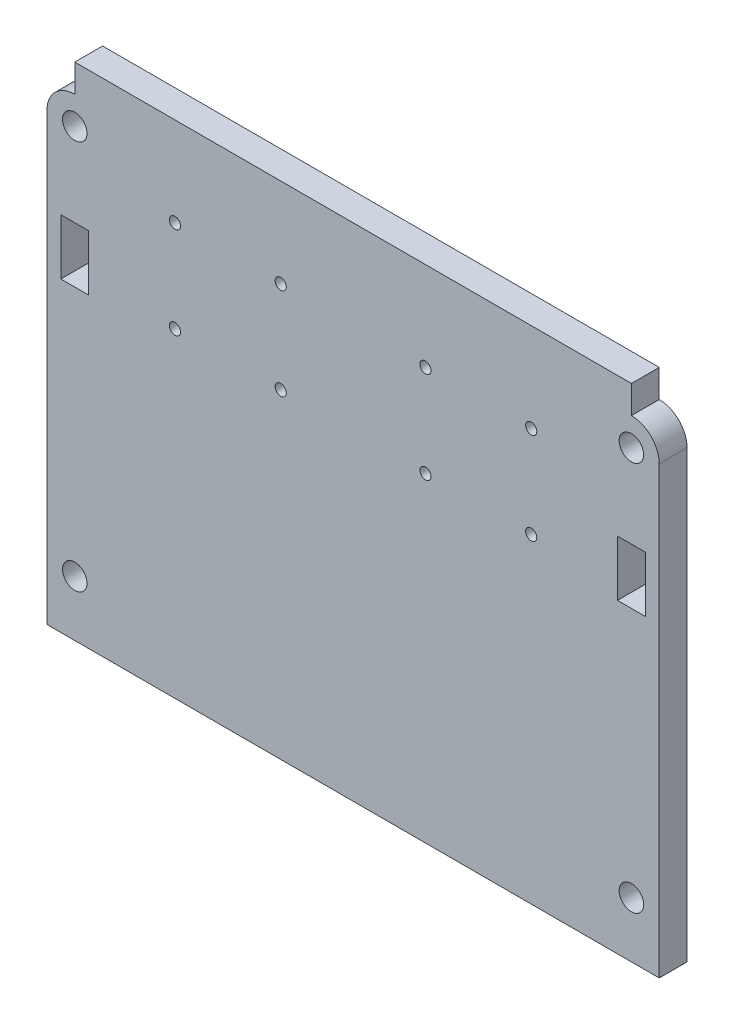
ISO-10303-21;
HEADER;
FILE_DESCRIPTION(('STEP AP214'),'2;1');
FILE_NAME('part.step','',(''),(''),'','','');
FILE_SCHEMA(('AUTOMOTIVE_DESIGN { 1 0 10303 214 1 1 1 1 }'));
ENDSEC;
DATA;
#1=APPLICATION_CONTEXT('core data for automotive mechanical design processes');
#2=APPLICATION_PROTOCOL_DEFINITION('international standard','automotive_design',2000,#1);
#3=PRODUCT_CONTEXT('',#1,'mechanical');
#4=PRODUCT('Part','Part','',(#3));
#5=PRODUCT_RELATED_PRODUCT_CATEGORY('part','',(#4));
#6=PRODUCT_DEFINITION_FORMATION('','',#4);
#7=PRODUCT_DEFINITION_CONTEXT('part definition',#1,'design');
#8=PRODUCT_DEFINITION('design','',#6,#7);
#9=PRODUCT_DEFINITION_SHAPE('','',#8);
#10=(LENGTH_UNIT() NAMED_UNIT(*) SI_UNIT(.MILLI.,.METRE.));
#11=(NAMED_UNIT(*) PLANE_ANGLE_UNIT() SI_UNIT($,.RADIAN.));
#12=(NAMED_UNIT(*) SI_UNIT($,.STERADIAN.) SOLID_ANGLE_UNIT());
#13=UNCERTAINTY_MEASURE_WITH_UNIT(LENGTH_MEASURE(1.E-05),#10,'distance_accuracy_value','');
#14=(GEOMETRIC_REPRESENTATION_CONTEXT(3) GLOBAL_UNCERTAINTY_ASSIGNED_CONTEXT((#13)) GLOBAL_UNIT_ASSIGNED_CONTEXT((#10,
#11,#12)) REPRESENTATION_CONTEXT('',''));
#15=CARTESIAN_POINT('',(0.,0.,0.));
#16=DIRECTION('',(0.,0.,1.));
#17=DIRECTION('',(1.,0.,0.));
#18=AXIS2_PLACEMENT_3D('',#15,#16,#17);
#19=CARTESIAN_POINT('',(100.,100.,5.));
#20=DIRECTION('',(0.,0.,-1.));
#21=DIRECTION('',(-1.,0.,0.));
#22=AXIS2_PLACEMENT_3D('',#19,#20,#21);
#23=PLANE('',#22);
#24=CARTESIAN_POINT('',(82.,94.,5.));
#25=DIRECTION('',(0.,0.,1.));
#26=DIRECTION('',(-1.,0.,0.));
#27=AXIS2_PLACEMENT_3D('',#24,#25,#26);
#28=CIRCLE('',#27,1.00000000000001);
#29=CARTESIAN_POINT('',(81.,94.,5.));
#30=VERTEX_POINT('',#29);
#31=EDGE_CURVE('E439',#30,#30,#28,.T.);
#32=ORIENTED_EDGE('',*,*,#31,.F.);
#33=EDGE_LOOP('',(#32));
#34=FACE_BOUND('',#33,.T.);
#35=CARTESIAN_POINT('',(63.,94.,5.));
#36=DIRECTION('',(0.,0.,1.));
#37=DIRECTION('',(-1.,0.,0.));
#38=AXIS2_PLACEMENT_3D('',#35,#36,#37);
#39=CIRCLE('',#38,0.999999999999992);
#40=CARTESIAN_POINT('',(62.,94.,5.));
#41=VERTEX_POINT('',#40);
#42=EDGE_CURVE('E441',#41,#41,#39,.T.);
#43=ORIENTED_EDGE('',*,*,#42,.F.);
#44=EDGE_LOOP('',(#43));
#45=FACE_BOUND('',#44,.T.);
#46=CARTESIAN_POINT('',(82.,77.5,5.));
#47=DIRECTION('',(0.,0.,1.));
#48=DIRECTION('',(-1.,0.,0.));
#49=AXIS2_PLACEMENT_3D('',#46,#47,#48);
#50=CIRCLE('',#49,0.999999999999998);
#51=CARTESIAN_POINT('',(81.,77.5,5.));
#52=VERTEX_POINT('',#51);
#53=EDGE_CURVE('E447',#52,#52,#50,.T.);
#54=ORIENTED_EDGE('',*,*,#53,.F.);
#55=EDGE_LOOP('',(#54));
#56=FACE_BOUND('',#55,.T.);
#57=CARTESIAN_POINT('',(63.,77.5,5.));
#58=DIRECTION('',(0.,0.,1.));
#59=DIRECTION('',(-1.,0.,0.));
#60=AXIS2_PLACEMENT_3D('',#57,#58,#59);
#61=CIRCLE('',#60,0.999999999999985);
#62=CARTESIAN_POINT('',(62.,77.5,5.));
#63=VERTEX_POINT('',#62);
#64=EDGE_CURVE('E453',#63,#63,#61,.T.);
#65=ORIENTED_EDGE('',*,*,#64,.F.);
#66=EDGE_LOOP('',(#65));
#67=FACE_BOUND('',#66,.T.);
#68=CARTESIAN_POINT('',(37.,77.5,5.));
#69=DIRECTION('',(0.,0.,1.));
#70=DIRECTION('',(1.,0.,0.));
#71=AXIS2_PLACEMENT_3D('',#68,#69,#70);
#72=CIRCLE('',#71,0.999999999999998);
#73=CARTESIAN_POINT('',(38.,77.5,5.));
#74=VERTEX_POINT('',#73);
#75=EDGE_CURVE('E459',#74,#74,#72,.T.);
#76=ORIENTED_EDGE('',*,*,#75,.F.);
#77=EDGE_LOOP('',(#76));
#78=FACE_BOUND('',#77,.T.);
#79=CARTESIAN_POINT('',(18.,77.5,5.));
#80=DIRECTION('',(0.,0.,1.));
#81=DIRECTION('',(1.,0.,0.));
#82=AXIS2_PLACEMENT_3D('',#79,#80,#81);
#83=CIRCLE('',#82,1.);
#84=CARTESIAN_POINT('',(19.,77.5,5.));
#85=VERTEX_POINT('',#84);
#86=EDGE_CURVE('E465',#85,#85,#83,.T.);
#87=ORIENTED_EDGE('',*,*,#86,.F.);
#88=EDGE_LOOP('',(#87));
#89=FACE_BOUND('',#88,.T.);
#90=CARTESIAN_POINT('',(37.,94.,5.));
#91=DIRECTION('',(0.,0.,1.));
#92=DIRECTION('',(1.,0.,0.));
#93=AXIS2_PLACEMENT_3D('',#90,#91,#92);
#94=CIRCLE('',#93,0.999999999999998);
#95=CARTESIAN_POINT('',(38.,94.,5.));
#96=VERTEX_POINT('',#95);
#97=EDGE_CURVE('E471',#96,#96,#94,.T.);
#98=ORIENTED_EDGE('',*,*,#97,.F.);
#99=EDGE_LOOP('',(#98));
#100=FACE_BOUND('',#99,.T.);
#101=CARTESIAN_POINT('',(18.,94.,5.));
#102=DIRECTION('',(0.,0.,1.));
#103=DIRECTION('',(1.,0.,0.));
#104=AXIS2_PLACEMENT_3D('',#101,#102,#103);
#105=CIRCLE('',#104,1.);
#106=CARTESIAN_POINT('',(19.,94.,5.));
#107=VERTEX_POINT('',#106);
#108=EDGE_CURVE('E477',#107,#107,#105,.T.);
#109=ORIENTED_EDGE('',*,*,#108,.F.);
#110=EDGE_LOOP('',(#109));
#111=FACE_BOUND('',#110,.T.);
#112=CARTESIAN_POINT('',(0.,30.,5.));
#113=DIRECTION('',(0.,0.,1.));
#114=DIRECTION('',(1.,0.,0.));
#115=AXIS2_PLACEMENT_3D('',#112,#113,#114);
#116=CIRCLE('',#115,2.2);
#117=CARTESIAN_POINT('',(2.2,30.,5.));
#118=VERTEX_POINT('',#117);
#119=EDGE_CURVE('E183',#118,#118,#116,.T.);
#120=ORIENTED_EDGE('',*,*,#119,.F.);
#121=EDGE_LOOP('',(#120));
#122=FACE_BOUND('',#121,.T.);
#123=CARTESIAN_POINT('',(0.,100.,5.));
#124=DIRECTION('',(0.,0.,1.));
#125=DIRECTION('',(1.,0.,0.));
#126=AXIS2_PLACEMENT_3D('',#123,#124,#125);
#127=CIRCLE('',#126,2.2);
#128=CARTESIAN_POINT('',(2.2,100.,5.));
#129=VERTEX_POINT('',#128);
#130=EDGE_CURVE('E189',#129,#129,#127,.T.);
#131=ORIENTED_EDGE('',*,*,#130,.F.);
#132=EDGE_LOOP('',(#131));
#133=FACE_BOUND('',#132,.T.);
#134=DIRECTION('',(0.,-1.,0.));
#135=VECTOR('',#134,1.);
#136=CARTESIAN_POINT('',(-2.5,85.,5.));
#137=LINE('',#136,#135);
#138=CARTESIAN_POINT('',(-2.5,85.,5.));
#139=VERTEX_POINT('',#138);
#140=CARTESIAN_POINT('',(-2.5,75.,5.));
#141=VERTEX_POINT('',#140);
#142=EDGE_CURVE('E197',#139,#141,#137,.T.);
#143=ORIENTED_EDGE('',*,*,#142,.F.);
#144=DIRECTION('',(-1.,0.,0.));
#145=VECTOR('',#144,1.);
#146=CARTESIAN_POINT('',(0.,85.,5.));
#147=LINE('',#146,#145);
#148=CARTESIAN_POINT('',(2.5,85.,5.));
#149=VERTEX_POINT('',#148);
#150=EDGE_CURVE('E195',#149,#139,#147,.T.);
#151=ORIENTED_EDGE('',*,*,#150,.F.);
#152=DIRECTION('',(0.,1.,0.));
#153=VECTOR('',#152,1.);
#154=CARTESIAN_POINT('',(2.5,85.,5.));
#155=LINE('',#154,#153);
#156=CARTESIAN_POINT('',(2.5,75.,5.));
#157=VERTEX_POINT('',#156);
#158=EDGE_CURVE('E202',#157,#149,#155,.T.);
#159=ORIENTED_EDGE('',*,*,#158,.F.);
#160=DIRECTION('',(1.,0.,0.));
#161=VECTOR('',#160,1.);
#162=CARTESIAN_POINT('',(-2.5,75.,5.));
#163=LINE('',#162,#161);
#164=EDGE_CURVE('E200',#141,#157,#163,.T.);
#165=ORIENTED_EDGE('',*,*,#164,.F.);
#166=EDGE_LOOP('',(#143,#151,#159,#165));
#167=FACE_BOUND('',#166,.T.);
#168=DIRECTION('',(-1.,0.,0.));
#169=VECTOR('',#168,1.);
#170=CARTESIAN_POINT('',(0.,110.,5.));
#171=LINE('',#170,#169);
#172=CARTESIAN_POINT('',(100.,110.,5.));
#173=VERTEX_POINT('',#172);
#174=CARTESIAN_POINT('',(0.,110.,5.));
#175=VERTEX_POINT('',#174);
#176=EDGE_CURVE('E225',#173,#175,#171,.T.);
#177=ORIENTED_EDGE('',*,*,#176,.T.);
#178=DIRECTION('',(0.,-1.,0.));
#179=VECTOR('',#178,1.);
#180=CARTESIAN_POINT('',(0.,105.,5.));
#181=LINE('',#180,#179);
#182=CARTESIAN_POINT('',(0.,105.,5.));
#183=VERTEX_POINT('',#182);
#184=EDGE_CURVE('E228',#175,#183,#181,.T.);
#185=ORIENTED_EDGE('',*,*,#184,.T.);
#186=CARTESIAN_POINT('',(0.,100.,5.));
#187=DIRECTION('',(0.,0.,1.));
#188=DIRECTION('',(1.,0.,0.));
#189=AXIS2_PLACEMENT_3D('',#186,#187,#188);
#190=CIRCLE('',#189,5.);
#191=CARTESIAN_POINT('',(-5.,100.,5.));
#192=VERTEX_POINT('',#191);
#193=EDGE_CURVE('E231',#183,#192,#190,.T.);
#194=ORIENTED_EDGE('',*,*,#193,.T.);
#195=DIRECTION('',(0.,-1.,0.));
#196=VECTOR('',#195,1.);
#197=CARTESIAN_POINT('',(-5.,100.,5.));
#198=LINE('',#197,#196);
#199=CARTESIAN_POINT('',(-5.,20.,5.));
#200=VERTEX_POINT('',#199);
#201=EDGE_CURVE('E233',#192,#200,#198,.T.);
#202=ORIENTED_EDGE('',*,*,#201,.T.);
#203=DIRECTION('',(1.,0.,0.));
#204=VECTOR('',#203,1.);
#205=CARTESIAN_POINT('',(0.,20.,5.));
#206=LINE('',#205,#204);
#207=CARTESIAN_POINT('',(105.,20.,5.));
#208=VERTEX_POINT('',#207);
#209=EDGE_CURVE('E235',#200,#208,#206,.T.);
#210=ORIENTED_EDGE('',*,*,#209,.T.);
#211=DIRECTION('',(0.,1.,0.));
#212=VECTOR('',#211,1.);
#213=CARTESIAN_POINT('',(105.,100.,5.));
#214=LINE('',#213,#212);
#215=CARTESIAN_POINT('',(105.,100.,5.));
#216=VERTEX_POINT('',#215);
#217=EDGE_CURVE('E237',#208,#216,#214,.T.);
#218=ORIENTED_EDGE('',*,*,#217,.T.);
#219=CARTESIAN_POINT('',(100.,100.,5.));
#220=DIRECTION('',(0.,0.,1.));
#221=DIRECTION('',(-1.,0.,0.));
#222=AXIS2_PLACEMENT_3D('',#219,#220,#221);
#223=CIRCLE('',#222,5.);
#224=CARTESIAN_POINT('',(100.,105.,5.));
#225=VERTEX_POINT('',#224);
#226=EDGE_CURVE('E239',#216,#225,#223,.T.);
#227=ORIENTED_EDGE('',*,*,#226,.T.);
#228=DIRECTION('',(0.,1.,0.));
#229=VECTOR('',#228,1.);
#230=CARTESIAN_POINT('',(100.,105.,5.));
#231=LINE('',#230,#229);
#232=EDGE_CURVE('E241',#225,#173,#231,.T.);
#233=ORIENTED_EDGE('',*,*,#232,.T.);
#234=EDGE_LOOP('',(#177,#185,#194,#202,#210,#218,#227,#233));
#235=FACE_BOUND('',#234,.T.);
#236=DIRECTION('',(0.,-1.,0.));
#237=VECTOR('',#236,1.);
#238=CARTESIAN_POINT('',(97.5,85.,5.));
#239=LINE('',#238,#237);
#240=CARTESIAN_POINT('',(97.5,85.,5.));
#241=VERTEX_POINT('',#240);
#242=CARTESIAN_POINT('',(97.5,75.,5.));
#243=VERTEX_POINT('',#242);
#244=EDGE_CURVE('E148',#241,#243,#239,.T.);
#245=ORIENTED_EDGE('',*,*,#244,.F.);
#246=DIRECTION('',(-1.,0.,0.));
#247=VECTOR('',#246,1.);
#248=CARTESIAN_POINT('',(100.,85.,5.));
#249=LINE('',#248,#247);
#250=CARTESIAN_POINT('',(102.5,85.,5.));
#251=VERTEX_POINT('',#250);
#252=EDGE_CURVE('E143',#251,#241,#249,.T.);
#253=ORIENTED_EDGE('',*,*,#252,.F.);
#254=DIRECTION('',(0.,1.,0.));
#255=VECTOR('',#254,1.);
#256=CARTESIAN_POINT('',(102.5,85.,5.));
#257=LINE('',#256,#255);
#258=CARTESIAN_POINT('',(102.5,75.,5.));
#259=VERTEX_POINT('',#258);
#260=EDGE_CURVE('E165',#259,#251,#257,.T.);
#261=ORIENTED_EDGE('',*,*,#260,.F.);
#262=DIRECTION('',(1.,0.,0.));
#263=VECTOR('',#262,1.);
#264=CARTESIAN_POINT('',(100.,75.,5.));
#265=LINE('',#264,#263);
#266=EDGE_CURVE('E163',#243,#259,#265,.T.);
#267=ORIENTED_EDGE('',*,*,#266,.F.);
#268=EDGE_LOOP('',(#245,#253,#261,#267));
#269=FACE_BOUND('',#268,.T.);
#270=CARTESIAN_POINT('',(100.,30.,5.));
#271=DIRECTION('',(0.,0.,1.));
#272=DIRECTION('',(-1.,0.,0.));
#273=AXIS2_PLACEMENT_3D('',#270,#271,#272);
#274=CIRCLE('',#273,2.2);
#275=CARTESIAN_POINT('',(97.8,30.,5.));
#276=VERTEX_POINT('',#275);
#277=EDGE_CURVE('E172',#276,#276,#274,.T.);
#278=ORIENTED_EDGE('',*,*,#277,.F.);
#279=EDGE_LOOP('',(#278));
#280=FACE_BOUND('',#279,.T.);
#281=CARTESIAN_POINT('',(100.,100.,5.));
#282=DIRECTION('',(0.,0.,1.));
#283=DIRECTION('',(-1.,0.,0.));
#284=AXIS2_PLACEMENT_3D('',#281,#282,#283);
#285=CIRCLE('',#284,2.2);
#286=CARTESIAN_POINT('',(97.8,100.,5.));
#287=VERTEX_POINT('',#286);
#288=EDGE_CURVE('E486',#287,#287,#285,.T.);
#289=ORIENTED_EDGE('',*,*,#288,.F.);
#290=EDGE_LOOP('',(#289));
#291=FACE_BOUND('',#290,.T.);
#292=ADVANCED_FACE('F33',(#34,#45,#56,#67,#78,#89,#100,#111,#122,#133,#167,#235,#269,#280,#291),
#23,.F.);
#293=CARTESIAN_POINT('',(100.,100.,0.));
#294=DIRECTION('',(0.,0.,-1.));
#295=DIRECTION('',(-1.,0.,0.));
#296=AXIS2_PLACEMENT_3D('',#293,#294,#295);
#297=PLANE('',#296);
#298=CARTESIAN_POINT('',(82.,94.,0.));
#299=DIRECTION('',(0.,0.,1.));
#300=DIRECTION('',(-1.,0.,0.));
#301=AXIS2_PLACEMENT_3D('',#298,#299,#300);
#302=CIRCLE('',#301,1.00000000000001);
#303=CARTESIAN_POINT('',(81.,94.,0.));
#304=VERTEX_POINT('',#303);
#305=EDGE_CURVE('E437',#304,#304,#302,.T.);
#306=ORIENTED_EDGE('',*,*,#305,.T.);
#307=EDGE_LOOP('',(#306));
#308=FACE_BOUND('',#307,.T.);
#309=CARTESIAN_POINT('',(63.,94.,0.));
#310=DIRECTION('',(0.,0.,1.));
#311=DIRECTION('',(-1.,0.,0.));
#312=AXIS2_PLACEMENT_3D('',#309,#310,#311);
#313=CIRCLE('',#312,0.999999999999992);
#314=CARTESIAN_POINT('',(62.,94.,0.));
#315=VERTEX_POINT('',#314);
#316=EDGE_CURVE('E444',#315,#315,#313,.T.);
#317=ORIENTED_EDGE('',*,*,#316,.T.);
#318=EDGE_LOOP('',(#317));
#319=FACE_BOUND('',#318,.T.);
#320=CARTESIAN_POINT('',(82.,77.5,0.));
#321=DIRECTION('',(0.,0.,1.));
#322=DIRECTION('',(-1.,0.,0.));
#323=AXIS2_PLACEMENT_3D('',#320,#321,#322);
#324=CIRCLE('',#323,0.999999999999998);
#325=CARTESIAN_POINT('',(81.,77.5,0.));
#326=VERTEX_POINT('',#325);
#327=EDGE_CURVE('E450',#326,#326,#324,.T.);
#328=ORIENTED_EDGE('',*,*,#327,.T.);
#329=EDGE_LOOP('',(#328));
#330=FACE_BOUND('',#329,.T.);
#331=CARTESIAN_POINT('',(63.,77.5,0.));
#332=DIRECTION('',(0.,0.,1.));
#333=DIRECTION('',(-1.,0.,0.));
#334=AXIS2_PLACEMENT_3D('',#331,#332,#333);
#335=CIRCLE('',#334,0.999999999999985);
#336=CARTESIAN_POINT('',(62.,77.5,0.));
#337=VERTEX_POINT('',#336);
#338=EDGE_CURVE('E456',#337,#337,#335,.T.);
#339=ORIENTED_EDGE('',*,*,#338,.T.);
#340=EDGE_LOOP('',(#339));
#341=FACE_BOUND('',#340,.T.);
#342=CARTESIAN_POINT('',(37.,77.5,0.));
#343=DIRECTION('',(0.,0.,1.));
#344=DIRECTION('',(1.,0.,0.));
#345=AXIS2_PLACEMENT_3D('',#342,#343,#344);
#346=CIRCLE('',#345,0.999999999999998);
#347=CARTESIAN_POINT('',(38.,77.5,0.));
#348=VERTEX_POINT('',#347);
#349=EDGE_CURVE('E462',#348,#348,#346,.T.);
#350=ORIENTED_EDGE('',*,*,#349,.T.);
#351=EDGE_LOOP('',(#350));
#352=FACE_BOUND('',#351,.T.);
#353=CARTESIAN_POINT('',(18.,77.5,0.));
#354=DIRECTION('',(0.,0.,1.));
#355=DIRECTION('',(1.,0.,0.));
#356=AXIS2_PLACEMENT_3D('',#353,#354,#355);
#357=CIRCLE('',#356,1.);
#358=CARTESIAN_POINT('',(19.,77.5,0.));
#359=VERTEX_POINT('',#358);
#360=EDGE_CURVE('E468',#359,#359,#357,.T.);
#361=ORIENTED_EDGE('',*,*,#360,.T.);
#362=EDGE_LOOP('',(#361));
#363=FACE_BOUND('',#362,.T.);
#364=CARTESIAN_POINT('',(37.,94.,0.));
#365=DIRECTION('',(0.,0.,1.));
#366=DIRECTION('',(1.,0.,0.));
#367=AXIS2_PLACEMENT_3D('',#364,#365,#366);
#368=CIRCLE('',#367,0.999999999999998);
#369=CARTESIAN_POINT('',(38.,94.,0.));
#370=VERTEX_POINT('',#369);
#371=EDGE_CURVE('E474',#370,#370,#368,.T.);
#372=ORIENTED_EDGE('',*,*,#371,.T.);
#373=EDGE_LOOP('',(#372));
#374=FACE_BOUND('',#373,.T.);
#375=CARTESIAN_POINT('',(18.,94.,0.));
#376=DIRECTION('',(0.,0.,1.));
#377=DIRECTION('',(1.,0.,0.));
#378=AXIS2_PLACEMENT_3D('',#375,#376,#377);
#379=CIRCLE('',#378,1.);
#380=CARTESIAN_POINT('',(19.,94.,0.));
#381=VERTEX_POINT('',#380);
#382=EDGE_CURVE('E480',#381,#381,#379,.T.);
#383=ORIENTED_EDGE('',*,*,#382,.T.);
#384=EDGE_LOOP('',(#383));
#385=FACE_BOUND('',#384,.T.);
#386=CARTESIAN_POINT('',(100.,30.,0.));
#387=DIRECTION('',(0.,0.,1.));
#388=DIRECTION('',(-1.,0.,0.));
#389=AXIS2_PLACEMENT_3D('',#386,#387,#388);
#390=CIRCLE('',#389,2.2);
#391=CARTESIAN_POINT('',(97.8,30.,0.));
#392=VERTEX_POINT('',#391);
#393=EDGE_CURVE('E489',#392,#392,#390,.T.);
#394=ORIENTED_EDGE('',*,*,#393,.T.);
#395=EDGE_LOOP('',(#394));
#396=FACE_BOUND('',#395,.T.);
#397=CARTESIAN_POINT('',(0.,100.,0.));
#398=DIRECTION('',(0.,0.,1.));
#399=DIRECTION('',(1.,0.,0.));
#400=AXIS2_PLACEMENT_3D('',#397,#398,#399);
#401=CIRCLE('',#400,2.2);
#402=CARTESIAN_POINT('',(2.2,100.,0.));
#403=VERTEX_POINT('',#402);
#404=EDGE_CURVE('E186',#403,#403,#401,.T.);
#405=ORIENTED_EDGE('',*,*,#404,.T.);
#406=EDGE_LOOP('',(#405));
#407=FACE_BOUND('',#406,.T.);
#408=DIRECTION('',(-1.,0.,0.));
#409=VECTOR('',#408,1.);
#410=CARTESIAN_POINT('',(0.,110.,0.));
#411=LINE('',#410,#409);
#412=CARTESIAN_POINT('',(100.,110.,0.));
#413=VERTEX_POINT('',#412);
#414=CARTESIAN_POINT('',(0.,110.,0.));
#415=VERTEX_POINT('',#414);
#416=EDGE_CURVE('E224',#413,#415,#411,.T.);
#417=ORIENTED_EDGE('',*,*,#416,.F.);
#418=DIRECTION('',(0.,1.,0.));
#419=VECTOR('',#418,1.);
#420=CARTESIAN_POINT('',(100.,105.,0.));
#421=LINE('',#420,#419);
#422=CARTESIAN_POINT('',(100.,105.,0.));
#423=VERTEX_POINT('',#422);
#424=EDGE_CURVE('E229',#423,#413,#421,.T.);
#425=ORIENTED_EDGE('',*,*,#424,.F.);
#426=CARTESIAN_POINT('',(100.,100.,0.));
#427=DIRECTION('',(0.,0.,1.));
#428=DIRECTION('',(-1.,0.,0.));
#429=AXIS2_PLACEMENT_3D('',#426,#427,#428);
#430=CIRCLE('',#429,5.);
#431=CARTESIAN_POINT('',(105.,100.,0.));
#432=VERTEX_POINT('',#431);
#433=EDGE_CURVE('E257',#432,#423,#430,.T.);
#434=ORIENTED_EDGE('',*,*,#433,.F.);
#435=DIRECTION('',(0.,1.,0.));
#436=VECTOR('',#435,1.);
#437=CARTESIAN_POINT('',(105.,100.,0.));
#438=LINE('',#437,#436);
#439=CARTESIAN_POINT('',(105.,20.,0.));
#440=VERTEX_POINT('',#439);
#441=EDGE_CURVE('E255',#440,#432,#438,.T.);
#442=ORIENTED_EDGE('',*,*,#441,.F.);
#443=DIRECTION('',(1.,0.,0.));
#444=VECTOR('',#443,1.);
#445=CARTESIAN_POINT('',(100.,20.,0.));
#446=LINE('',#445,#444);
#447=CARTESIAN_POINT('',(-5.,20.,0.));
#448=VERTEX_POINT('',#447);
#449=EDGE_CURVE('E253',#448,#440,#446,.T.);
#450=ORIENTED_EDGE('',*,*,#449,.F.);
#451=DIRECTION('',(0.,-1.,0.));
#452=VECTOR('',#451,1.);
#453=CARTESIAN_POINT('',(-5.,100.,0.));
#454=LINE('',#453,#452);
#455=CARTESIAN_POINT('',(-5.,100.,0.));
#456=VERTEX_POINT('',#455);
#457=EDGE_CURVE('E250',#456,#448,#454,.T.);
#458=ORIENTED_EDGE('',*,*,#457,.F.);
#459=CARTESIAN_POINT('',(0.,100.,0.));
#460=DIRECTION('',(0.,0.,1.));
#461=DIRECTION('',(1.,0.,0.));
#462=AXIS2_PLACEMENT_3D('',#459,#460,#461);
#463=CIRCLE('',#462,5.);
#464=CARTESIAN_POINT('',(0.,105.,0.));
#465=VERTEX_POINT('',#464);
#466=EDGE_CURVE('E248',#465,#456,#463,.T.);
#467=ORIENTED_EDGE('',*,*,#466,.F.);
#468=DIRECTION('',(0.,-1.,0.));
#469=VECTOR('',#468,1.);
#470=CARTESIAN_POINT('',(0.,105.,0.));
#471=LINE('',#470,#469);
#472=EDGE_CURVE('E246',#415,#465,#471,.T.);
#473=ORIENTED_EDGE('',*,*,#472,.F.);
#474=EDGE_LOOP('',(#417,#425,#434,#442,#450,#458,#467,#473));
#475=FACE_BOUND('',#474,.T.);
#476=DIRECTION('',(-1.,0.,0.));
#477=VECTOR('',#476,1.);
#478=CARTESIAN_POINT('',(0.,85.,0.));
#479=LINE('',#478,#477);
#480=CARTESIAN_POINT('',(2.5,85.,0.));
#481=VERTEX_POINT('',#480);
#482=CARTESIAN_POINT('',(-2.5,85.,0.));
#483=VERTEX_POINT('',#482);
#484=EDGE_CURVE('E198',#481,#483,#479,.T.);
#485=ORIENTED_EDGE('',*,*,#484,.T.);
#486=DIRECTION('',(0.,-1.,0.));
#487=VECTOR('',#486,1.);
#488=CARTESIAN_POINT('',(-2.5,85.,0.));
#489=LINE('',#488,#487);
#490=CARTESIAN_POINT('',(-2.5,75.,0.));
#491=VERTEX_POINT('',#490);
#492=EDGE_CURVE('E192',#483,#491,#489,.T.);
#493=ORIENTED_EDGE('',*,*,#492,.T.);
#494=DIRECTION('',(1.,0.,0.));
#495=VECTOR('',#494,1.);
#496=CARTESIAN_POINT('',(0.,75.,0.));
#497=LINE('',#496,#495);
#498=CARTESIAN_POINT('',(2.5,75.,0.));
#499=VERTEX_POINT('',#498);
#500=EDGE_CURVE('E208',#491,#499,#497,.T.);
#501=ORIENTED_EDGE('',*,*,#500,.T.);
#502=DIRECTION('',(0.,1.,0.));
#503=VECTOR('',#502,1.);
#504=CARTESIAN_POINT('',(2.5,85.,0.));
#505=LINE('',#504,#503);
#506=EDGE_CURVE('E211',#499,#481,#505,.T.);
#507=ORIENTED_EDGE('',*,*,#506,.T.);
#508=EDGE_LOOP('',(#485,#493,#501,#507));
#509=FACE_BOUND('',#508,.T.);
#510=CARTESIAN_POINT('',(0.,30.,0.));
#511=DIRECTION('',(0.,0.,1.));
#512=DIRECTION('',(1.,0.,0.));
#513=AXIS2_PLACEMENT_3D('',#510,#511,#512);
#514=CIRCLE('',#513,2.2);
#515=CARTESIAN_POINT('',(2.2,30.,0.));
#516=VERTEX_POINT('',#515);
#517=EDGE_CURVE('E158',#516,#516,#514,.T.);
#518=ORIENTED_EDGE('',*,*,#517,.T.);
#519=EDGE_LOOP('',(#518));
#520=FACE_BOUND('',#519,.T.);
#521=DIRECTION('',(-1.,0.,0.));
#522=VECTOR('',#521,1.);
#523=CARTESIAN_POINT('',(100.,85.,0.));
#524=LINE('',#523,#522);
#525=CARTESIAN_POINT('',(102.5,85.,0.));
#526=VERTEX_POINT('',#525);
#527=CARTESIAN_POINT('',(97.5,85.,0.));
#528=VERTEX_POINT('',#527);
#529=EDGE_CURVE('E149',#526,#528,#524,.T.);
#530=ORIENTED_EDGE('',*,*,#529,.T.);
#531=DIRECTION('',(0.,-1.,0.));
#532=VECTOR('',#531,1.);
#533=CARTESIAN_POINT('',(97.5,85.,0.));
#534=LINE('',#533,#532);
#535=CARTESIAN_POINT('',(97.5,75.,0.));
#536=VERTEX_POINT('',#535);
#537=EDGE_CURVE('E156',#528,#536,#534,.T.);
#538=ORIENTED_EDGE('',*,*,#537,.T.);
#539=DIRECTION('',(1.,0.,0.));
#540=VECTOR('',#539,1.);
#541=CARTESIAN_POINT('',(102.5,75.,0.));
#542=LINE('',#541,#540);
#543=CARTESIAN_POINT('',(102.5,75.,0.));
#544=VERTEX_POINT('',#543);
#545=EDGE_CURVE('E171',#536,#544,#542,.T.);
#546=ORIENTED_EDGE('',*,*,#545,.T.);
#547=DIRECTION('',(0.,1.,0.));
#548=VECTOR('',#547,1.);
#549=CARTESIAN_POINT('',(102.5,85.,0.));
#550=LINE('',#549,#548);
#551=EDGE_CURVE('E175',#544,#526,#550,.T.);
#552=ORIENTED_EDGE('',*,*,#551,.T.);
#553=EDGE_LOOP('',(#530,#538,#546,#552));
#554=FACE_BOUND('',#553,.T.);
#555=CARTESIAN_POINT('',(100.,100.,0.));
#556=DIRECTION('',(0.,0.,1.));
#557=DIRECTION('',(-1.,0.,0.));
#558=AXIS2_PLACEMENT_3D('',#555,#556,#557);
#559=CIRCLE('',#558,2.2);
#560=CARTESIAN_POINT('',(97.8,100.,0.));
#561=VERTEX_POINT('',#560);
#562=EDGE_CURVE('E483',#561,#561,#559,.T.);
#563=ORIENTED_EDGE('',*,*,#562,.T.);
#564=EDGE_LOOP('',(#563));
#565=FACE_BOUND('',#564,.T.);
#566=ADVANCED_FACE('F287',(#308,#319,#330,#341,#352,#363,#374,#385,#396,#407,#475,#509,#520,
#554,#565),#297,.T.);
#567=CARTESIAN_POINT('',(0.,110.,5.));
#568=DIRECTION('',(0.,-1.,0.));
#569=DIRECTION('',(0.,0.,-1.));
#570=AXIS2_PLACEMENT_3D('',#567,#568,#569);
#571=PLANE('',#570);
#572=ORIENTED_EDGE('',*,*,#416,.T.);
#573=DIRECTION('',(0.,0.,-1.));
#574=VECTOR('',#573,1.);
#575=CARTESIAN_POINT('',(0.,110.,5.));
#576=LINE('',#575,#574);
#577=EDGE_CURVE('E11',#175,#415,#576,.T.);
#578=ORIENTED_EDGE('',*,*,#577,.F.);
#579=ORIENTED_EDGE('',*,*,#176,.F.);
#580=DIRECTION('',(0.,0.,-1.));
#581=VECTOR('',#580,1.);
#582=CARTESIAN_POINT('',(100.,110.,5.));
#583=LINE('',#582,#581);
#584=EDGE_CURVE('E243',#173,#413,#583,.T.);
#585=ORIENTED_EDGE('',*,*,#584,.T.);
#586=EDGE_LOOP('',(#572,#578,#579,#585));
#587=FACE_BOUND('',#586,.T.);
#588=ADVANCED_FACE('F35',(#587),#571,.F.);
#589=CARTESIAN_POINT('',(0.,105.,5.));
#590=DIRECTION('',(1.,0.,0.));
#591=DIRECTION('',(0.,0.,-1.));
#592=AXIS2_PLACEMENT_3D('',#589,#590,#591);
#593=PLANE('',#592);
#594=ORIENTED_EDGE('',*,*,#472,.T.);
#595=DIRECTION('',(0.,0.,-1.));
#596=VECTOR('',#595,1.);
#597=CARTESIAN_POINT('',(0.,105.,5.));
#598=LINE('',#597,#596);
#599=EDGE_CURVE('E41',#183,#465,#598,.T.);
#600=ORIENTED_EDGE('',*,*,#599,.F.);
#601=ORIENTED_EDGE('',*,*,#184,.F.);
#602=ORIENTED_EDGE('',*,*,#577,.T.);
#603=EDGE_LOOP('',(#594,#600,#601,#602));
#604=FACE_BOUND('',#603,.T.);
#605=ADVANCED_FACE('F303',(#604),#593,.F.);
#606=CARTESIAN_POINT('',(0.,100.,5.));
#607=DIRECTION('',(0.,0.,-1.));
#608=DIRECTION('',(-1.,0.,0.));
#609=AXIS2_PLACEMENT_3D('',#606,#607,#608);
#610=CYLINDRICAL_SURFACE('',#609,5.);
#611=ORIENTED_EDGE('',*,*,#466,.T.);
#612=DIRECTION('',(0.,0.,-1.));
#613=VECTOR('',#612,1.);
#614=CARTESIAN_POINT('',(-5.,100.,5.));
#615=LINE('',#614,#613);
#616=EDGE_CURVE('E274',#192,#456,#615,.T.);
#617=ORIENTED_EDGE('',*,*,#616,.F.);
#618=ORIENTED_EDGE('',*,*,#193,.F.);
#619=ORIENTED_EDGE('',*,*,#599,.T.);
#620=EDGE_LOOP('',(#611,#617,#618,#619));
#621=FACE_BOUND('',#620,.T.);
#622=ADVANCED_FACE('F281',(#621),#610,.T.);
#623=CARTESIAN_POINT('',(-5.,100.,5.));
#624=DIRECTION('',(1.,0.,0.));
#625=DIRECTION('',(0.,0.,-1.));
#626=AXIS2_PLACEMENT_3D('',#623,#624,#625);
#627=PLANE('',#626);
#628=ORIENTED_EDGE('',*,*,#457,.T.);
#629=DIRECTION('',(0.,0.,-1.));
#630=VECTOR('',#629,1.);
#631=CARTESIAN_POINT('',(-5.,20.,5.));
#632=LINE('',#631,#630);
#633=EDGE_CURVE('E271',#200,#448,#632,.T.);
#634=ORIENTED_EDGE('',*,*,#633,.F.);
#635=ORIENTED_EDGE('',*,*,#201,.F.);
#636=ORIENTED_EDGE('',*,*,#616,.T.);
#637=EDGE_LOOP('',(#628,#634,#635,#636));
#638=FACE_BOUND('',#637,.T.);
#639=ADVANCED_FACE('F292',(#638),#627,.F.);
#640=CARTESIAN_POINT('',(100.,20.,5.));
#641=DIRECTION('',(0.,1.,0.));
#642=DIRECTION('',(-1.,0.,0.));
#643=AXIS2_PLACEMENT_3D('',#640,#641,#642);
#644=PLANE('',#643);
#645=ORIENTED_EDGE('',*,*,#449,.T.);
#646=DIRECTION('',(0.,0.,-1.));
#647=VECTOR('',#646,1.);
#648=CARTESIAN_POINT('',(105.,20.,5.));
#649=LINE('',#648,#647);
#650=EDGE_CURVE('E268',#208,#440,#649,.T.);
#651=ORIENTED_EDGE('',*,*,#650,.F.);
#652=ORIENTED_EDGE('',*,*,#209,.F.);
#653=ORIENTED_EDGE('',*,*,#633,.T.);
#654=EDGE_LOOP('',(#645,#651,#652,#653));
#655=FACE_BOUND('',#654,.T.);
#656=ADVANCED_FACE('F296',(#655),#644,.F.);
#657=CARTESIAN_POINT('',(105.,100.,5.));
#658=DIRECTION('',(-1.,0.,0.));
#659=DIRECTION('',(0.,0.,1.));
#660=AXIS2_PLACEMENT_3D('',#657,#658,#659);
#661=PLANE('',#660);
#662=ORIENTED_EDGE('',*,*,#441,.T.);
#663=DIRECTION('',(0.,0.,-1.));
#664=VECTOR('',#663,1.);
#665=CARTESIAN_POINT('',(105.,100.,5.));
#666=LINE('',#665,#664);
#667=EDGE_CURVE('E265',#216,#432,#666,.T.);
#668=ORIENTED_EDGE('',*,*,#667,.F.);
#669=ORIENTED_EDGE('',*,*,#217,.F.);
#670=ORIENTED_EDGE('',*,*,#650,.T.);
#671=EDGE_LOOP('',(#662,#668,#669,#670));
#672=FACE_BOUND('',#671,.T.);
#673=ADVANCED_FACE('F316',(#672),#661,.F.);
#674=CARTESIAN_POINT('',(100.,100.,5.));
#675=DIRECTION('',(0.,0.,-1.));
#676=DIRECTION('',(-1.,0.,0.));
#677=AXIS2_PLACEMENT_3D('',#674,#675,#676);
#678=CYLINDRICAL_SURFACE('',#677,5.);
#679=ORIENTED_EDGE('',*,*,#433,.T.);
#680=DIRECTION('',(0.,0.,-1.));
#681=VECTOR('',#680,1.);
#682=CARTESIAN_POINT('',(100.,105.,5.));
#683=LINE('',#682,#681);
#684=EDGE_CURVE('E262',#225,#423,#683,.T.);
#685=ORIENTED_EDGE('',*,*,#684,.F.);
#686=ORIENTED_EDGE('',*,*,#226,.F.);
#687=ORIENTED_EDGE('',*,*,#667,.T.);
#688=EDGE_LOOP('',(#679,#685,#686,#687));
#689=FACE_BOUND('',#688,.T.);
#690=ADVANCED_FACE('F314',(#689),#678,.T.);
#691=CARTESIAN_POINT('',(100.,105.,5.));
#692=DIRECTION('',(-1.,0.,0.));
#693=DIRECTION('',(0.,0.,1.));
#694=AXIS2_PLACEMENT_3D('',#691,#692,#693);
#695=PLANE('',#694);
#696=ORIENTED_EDGE('',*,*,#424,.T.);
#697=ORIENTED_EDGE('',*,*,#584,.F.);
#698=ORIENTED_EDGE('',*,*,#232,.F.);
#699=ORIENTED_EDGE('',*,*,#684,.T.);
#700=EDGE_LOOP('',(#696,#697,#698,#699));
#701=FACE_BOUND('',#700,.T.);
#702=ADVANCED_FACE('F309',(#701),#695,.F.);
#703=CARTESIAN_POINT('',(-2.5,85.,5.));
#704=DIRECTION('',(1.,0.,0.));
#705=DIRECTION('',(0.,1.,0.));
#706=AXIS2_PLACEMENT_3D('',#703,#704,#705);
#707=PLANE('',#706);
#708=ORIENTED_EDGE('',*,*,#492,.F.);
#709=DIRECTION('',(0.,0.,-1.));
#710=VECTOR('',#709,1.);
#711=CARTESIAN_POINT('',(-2.5,85.,5.));
#712=LINE('',#711,#710);
#713=EDGE_CURVE('E222',#139,#483,#712,.T.);
#714=ORIENTED_EDGE('',*,*,#713,.F.);
#715=ORIENTED_EDGE('',*,*,#142,.T.);
#716=DIRECTION('',(0.,0.,-1.));
#717=VECTOR('',#716,1.);
#718=CARTESIAN_POINT('',(-2.5,75.,5.));
#719=LINE('',#718,#717);
#720=EDGE_CURVE('E219',#141,#491,#719,.T.);
#721=ORIENTED_EDGE('',*,*,#720,.T.);
#722=EDGE_LOOP('',(#708,#714,#715,#721));
#723=FACE_BOUND('',#722,.T.);
#724=ADVANCED_FACE('F337',(#723),#707,.T.);
#725=CARTESIAN_POINT('',(0.,75.,5.));
#726=DIRECTION('',(0.,1.,0.));
#727=DIRECTION('',(0.,0.,1.));
#728=AXIS2_PLACEMENT_3D('',#725,#726,#727);
#729=PLANE('',#728);
#730=ORIENTED_EDGE('',*,*,#500,.F.);
#731=ORIENTED_EDGE('',*,*,#720,.F.);
#732=ORIENTED_EDGE('',*,*,#164,.T.);
#733=DIRECTION('',(0.,0.,-1.));
#734=VECTOR('',#733,1.);
#735=CARTESIAN_POINT('',(2.5,75.,5.));
#736=LINE('',#735,#734);
#737=EDGE_CURVE('E217',#157,#499,#736,.T.);
#738=ORIENTED_EDGE('',*,*,#737,.T.);
#739=EDGE_LOOP('',(#730,#731,#732,#738));
#740=FACE_BOUND('',#739,.T.);
#741=ADVANCED_FACE('F344',(#740),#729,.T.);
#742=CARTESIAN_POINT('',(2.5,85.,5.));
#743=DIRECTION('',(-1.,0.,0.));
#744=DIRECTION('',(0.,-1.,0.));
#745=AXIS2_PLACEMENT_3D('',#742,#743,#744);
#746=PLANE('',#745);
#747=ORIENTED_EDGE('',*,*,#506,.F.);
#748=ORIENTED_EDGE('',*,*,#737,.F.);
#749=ORIENTED_EDGE('',*,*,#158,.T.);
#750=DIRECTION('',(0.,0.,-1.));
#751=VECTOR('',#750,1.);
#752=CARTESIAN_POINT('',(2.5,85.,5.));
#753=LINE('',#752,#751);
#754=EDGE_CURVE('E205',#149,#481,#753,.T.);
#755=ORIENTED_EDGE('',*,*,#754,.T.);
#756=EDGE_LOOP('',(#747,#748,#749,#755));
#757=FACE_BOUND('',#756,.T.);
#758=ADVANCED_FACE('F349',(#757),#746,.T.);
#759=CARTESIAN_POINT('',(0.,85.,5.));
#760=DIRECTION('',(0.,-1.,0.));
#761=DIRECTION('',(0.,0.,-1.));
#762=AXIS2_PLACEMENT_3D('',#759,#760,#761);
#763=PLANE('',#762);
#764=ORIENTED_EDGE('',*,*,#484,.F.);
#765=ORIENTED_EDGE('',*,*,#754,.F.);
#766=ORIENTED_EDGE('',*,*,#150,.T.);
#767=ORIENTED_EDGE('',*,*,#713,.T.);
#768=EDGE_LOOP('',(#764,#765,#766,#767));
#769=FACE_BOUND('',#768,.T.);
#770=ADVANCED_FACE('F359',(#769),#763,.T.);
#771=CARTESIAN_POINT('',(0.,100.,5.));
#772=DIRECTION('',(0.,0.,-1.));
#773=DIRECTION('',(-1.,0.,0.));
#774=AXIS2_PLACEMENT_3D('',#771,#772,#773);
#775=CYLINDRICAL_SURFACE('',#774,2.2);
#776=ORIENTED_EDGE('',*,*,#130,.T.);
#777=EDGE_LOOP('',(#776));
#778=FACE_BOUND('',#777,.T.);
#779=ORIENTED_EDGE('',*,*,#404,.F.);
#780=EDGE_LOOP('',(#779));
#781=FACE_BOUND('',#780,.T.);
#782=ADVANCED_FACE('F371',(#778,#781),#775,.F.);
#783=CARTESIAN_POINT('',(0.,30.,5.));
#784=DIRECTION('',(0.,0.,-1.));
#785=DIRECTION('',(-1.,0.,0.));
#786=AXIS2_PLACEMENT_3D('',#783,#784,#785);
#787=CYLINDRICAL_SURFACE('',#786,2.2);
#788=ORIENTED_EDGE('',*,*,#119,.T.);
#789=EDGE_LOOP('',(#788));
#790=FACE_BOUND('',#789,.T.);
#791=ORIENTED_EDGE('',*,*,#517,.F.);
#792=EDGE_LOOP('',(#791));
#793=FACE_BOUND('',#792,.T.);
#794=ADVANCED_FACE('F376',(#790,#793),#787,.F.);
#795=CARTESIAN_POINT('',(97.5,85.,5.));
#796=DIRECTION('',(1.,0.,0.));
#797=DIRECTION('',(0.,0.,-1.));
#798=AXIS2_PLACEMENT_3D('',#795,#796,#797);
#799=PLANE('',#798);
#800=ORIENTED_EDGE('',*,*,#537,.F.);
#801=DIRECTION('',(0.,0.,-1.));
#802=VECTOR('',#801,1.);
#803=CARTESIAN_POINT('',(97.5,85.,5.));
#804=LINE('',#803,#802);
#805=EDGE_CURVE('E53',#241,#528,#804,.T.);
#806=ORIENTED_EDGE('',*,*,#805,.F.);
#807=ORIENTED_EDGE('',*,*,#244,.T.);
#808=DIRECTION('',(0.,0.,-1.));
#809=VECTOR('',#808,1.);
#810=CARTESIAN_POINT('',(97.5,75.,5.));
#811=LINE('',#810,#809);
#812=EDGE_CURVE('E159',#243,#536,#811,.T.);
#813=ORIENTED_EDGE('',*,*,#812,.T.);
#814=EDGE_LOOP('',(#800,#806,#807,#813));
#815=FACE_BOUND('',#814,.T.);
#816=ADVANCED_FACE('F152',(#815),#799,.T.);
#817=CARTESIAN_POINT('',(102.5,75.,5.));
#818=DIRECTION('',(0.,1.,0.));
#819=DIRECTION('',(0.,0.,1.));
#820=AXIS2_PLACEMENT_3D('',#817,#818,#819);
#821=PLANE('',#820);
#822=ORIENTED_EDGE('',*,*,#545,.F.);
#823=ORIENTED_EDGE('',*,*,#812,.F.);
#824=ORIENTED_EDGE('',*,*,#266,.T.);
#825=DIRECTION('',(0.,0.,-1.));
#826=VECTOR('',#825,1.);
#827=CARTESIAN_POINT('',(102.5,75.,5.));
#828=LINE('',#827,#826);
#829=EDGE_CURVE('E180',#259,#544,#828,.T.);
#830=ORIENTED_EDGE('',*,*,#829,.T.);
#831=EDGE_LOOP('',(#822,#823,#824,#830));
#832=FACE_BOUND('',#831,.T.);
#833=ADVANCED_FACE('F383',(#832),#821,.T.);
#834=CARTESIAN_POINT('',(102.5,85.,5.));
#835=DIRECTION('',(-1.,0.,0.));
#836=DIRECTION('',(0.,0.,1.));
#837=AXIS2_PLACEMENT_3D('',#834,#835,#836);
#838=PLANE('',#837);
#839=ORIENTED_EDGE('',*,*,#551,.F.);
#840=ORIENTED_EDGE('',*,*,#829,.F.);
#841=ORIENTED_EDGE('',*,*,#260,.T.);
#842=DIRECTION('',(0.,0.,-1.));
#843=VECTOR('',#842,1.);
#844=CARTESIAN_POINT('',(102.5,85.,5.));
#845=LINE('',#844,#843);
#846=EDGE_CURVE('E48',#251,#526,#845,.T.);
#847=ORIENTED_EDGE('',*,*,#846,.T.);
#848=EDGE_LOOP('',(#839,#840,#841,#847));
#849=FACE_BOUND('',#848,.T.);
#850=ADVANCED_FACE('F386',(#849),#838,.T.);
#851=CARTESIAN_POINT('',(100.,85.,5.));
#852=DIRECTION('',(0.,-1.,0.));
#853=DIRECTION('',(0.,0.,-1.));
#854=AXIS2_PLACEMENT_3D('',#851,#852,#853);
#855=PLANE('',#854);
#856=ORIENTED_EDGE('',*,*,#529,.F.);
#857=ORIENTED_EDGE('',*,*,#846,.F.);
#858=ORIENTED_EDGE('',*,*,#252,.T.);
#859=ORIENTED_EDGE('',*,*,#805,.T.);
#860=EDGE_LOOP('',(#856,#857,#858,#859));
#861=FACE_BOUND('',#860,.T.);
#862=ADVANCED_FACE('F144',(#861),#855,.T.);
#863=CARTESIAN_POINT('',(100.,30.,5.));
#864=DIRECTION('',(0.,0.,-1.));
#865=DIRECTION('',(-1.,0.,0.));
#866=AXIS2_PLACEMENT_3D('',#863,#864,#865);
#867=CYLINDRICAL_SURFACE('',#866,2.2);
#868=ORIENTED_EDGE('',*,*,#277,.T.);
#869=EDGE_LOOP('',(#868));
#870=FACE_BOUND('',#869,.T.);
#871=ORIENTED_EDGE('',*,*,#393,.F.);
#872=EDGE_LOOP('',(#871));
#873=FACE_BOUND('',#872,.T.);
#874=ADVANCED_FACE('F393',(#870,#873),#867,.F.);
#875=CARTESIAN_POINT('',(100.,100.,5.));
#876=DIRECTION('',(0.,0.,-1.));
#877=DIRECTION('',(-1.,0.,0.));
#878=AXIS2_PLACEMENT_3D('',#875,#876,#877);
#879=CYLINDRICAL_SURFACE('',#878,2.2);
#880=ORIENTED_EDGE('',*,*,#288,.T.);
#881=EDGE_LOOP('',(#880));
#882=FACE_BOUND('',#881,.T.);
#883=ORIENTED_EDGE('',*,*,#562,.F.);
#884=EDGE_LOOP('',(#883));
#885=FACE_BOUND('',#884,.T.);
#886=ADVANCED_FACE('F396',(#882,#885),#879,.F.);
#887=CARTESIAN_POINT('',(18.,94.,0.));
#888=DIRECTION('',(0.,0.,1.));
#889=DIRECTION('',(1.,0.,0.));
#890=AXIS2_PLACEMENT_3D('',#887,#888,#889);
#891=CYLINDRICAL_SURFACE('',#890,1.);
#892=ORIENTED_EDGE('',*,*,#382,.F.);
#893=EDGE_LOOP('',(#892));
#894=FACE_BOUND('',#893,.T.);
#895=ORIENTED_EDGE('',*,*,#108,.T.);
#896=EDGE_LOOP('',(#895));
#897=FACE_BOUND('',#896,.T.);
#898=ADVANCED_FACE('F400',(#894,#897),#891,.F.);
#899=CARTESIAN_POINT('',(37.,94.,0.));
#900=DIRECTION('',(0.,0.,1.));
#901=DIRECTION('',(1.,0.,0.));
#902=AXIS2_PLACEMENT_3D('',#899,#900,#901);
#903=CYLINDRICAL_SURFACE('',#902,0.999999999999998);
#904=ORIENTED_EDGE('',*,*,#371,.F.);
#905=EDGE_LOOP('',(#904));
#906=FACE_BOUND('',#905,.T.);
#907=ORIENTED_EDGE('',*,*,#97,.T.);
#908=EDGE_LOOP('',(#907));
#909=FACE_BOUND('',#908,.T.);
#910=ADVANCED_FACE('F404',(#906,#909),#903,.F.);
#911=CARTESIAN_POINT('',(18.,77.5,0.));
#912=DIRECTION('',(0.,0.,1.));
#913=DIRECTION('',(1.,0.,0.));
#914=AXIS2_PLACEMENT_3D('',#911,#912,#913);
#915=CYLINDRICAL_SURFACE('',#914,1.);
#916=ORIENTED_EDGE('',*,*,#360,.F.);
#917=EDGE_LOOP('',(#916));
#918=FACE_BOUND('',#917,.T.);
#919=ORIENTED_EDGE('',*,*,#86,.T.);
#920=EDGE_LOOP('',(#919));
#921=FACE_BOUND('',#920,.T.);
#922=ADVANCED_FACE('F408',(#918,#921),#915,.F.);
#923=CARTESIAN_POINT('',(37.,77.5,0.));
#924=DIRECTION('',(0.,0.,1.));
#925=DIRECTION('',(1.,0.,0.));
#926=AXIS2_PLACEMENT_3D('',#923,#924,#925);
#927=CYLINDRICAL_SURFACE('',#926,0.999999999999998);
#928=ORIENTED_EDGE('',*,*,#349,.F.);
#929=EDGE_LOOP('',(#928));
#930=FACE_BOUND('',#929,.T.);
#931=ORIENTED_EDGE('',*,*,#75,.T.);
#932=EDGE_LOOP('',(#931));
#933=FACE_BOUND('',#932,.T.);
#934=ADVANCED_FACE('F412',(#930,#933),#927,.F.);
#935=CARTESIAN_POINT('',(63.,77.5,0.));
#936=DIRECTION('',(0.,0.,1.));
#937=DIRECTION('',(1.,0.,0.));
#938=AXIS2_PLACEMENT_3D('',#935,#936,#937);
#939=CYLINDRICAL_SURFACE('',#938,0.999999999999985);
#940=ORIENTED_EDGE('',*,*,#338,.F.);
#941=EDGE_LOOP('',(#940));
#942=FACE_BOUND('',#941,.T.);
#943=ORIENTED_EDGE('',*,*,#64,.T.);
#944=EDGE_LOOP('',(#943));
#945=FACE_BOUND('',#944,.T.);
#946=ADVANCED_FACE('F416',(#942,#945),#939,.F.);
#947=CARTESIAN_POINT('',(82.,77.5,0.));
#948=DIRECTION('',(0.,0.,1.));
#949=DIRECTION('',(1.,0.,0.));
#950=AXIS2_PLACEMENT_3D('',#947,#948,#949);
#951=CYLINDRICAL_SURFACE('',#950,0.999999999999998);
#952=ORIENTED_EDGE('',*,*,#327,.F.);
#953=EDGE_LOOP('',(#952));
#954=FACE_BOUND('',#953,.T.);
#955=ORIENTED_EDGE('',*,*,#53,.T.);
#956=EDGE_LOOP('',(#955));
#957=FACE_BOUND('',#956,.T.);
#958=ADVANCED_FACE('F420',(#954,#957),#951,.F.);
#959=CARTESIAN_POINT('',(63.,94.,0.));
#960=DIRECTION('',(0.,0.,1.));
#961=DIRECTION('',(1.,0.,0.));
#962=AXIS2_PLACEMENT_3D('',#959,#960,#961);
#963=CYLINDRICAL_SURFACE('',#962,0.999999999999992);
#964=ORIENTED_EDGE('',*,*,#316,.F.);
#965=EDGE_LOOP('',(#964));
#966=FACE_BOUND('',#965,.T.);
#967=ORIENTED_EDGE('',*,*,#42,.T.);
#968=EDGE_LOOP('',(#967));
#969=FACE_BOUND('',#968,.T.);
#970=ADVANCED_FACE('F424',(#966,#969),#963,.F.);
#971=CARTESIAN_POINT('',(82.,94.,0.));
#972=DIRECTION('',(0.,0.,1.));
#973=DIRECTION('',(1.,0.,0.));
#974=AXIS2_PLACEMENT_3D('',#971,#972,#973);
#975=CYLINDRICAL_SURFACE('',#974,1.00000000000001);
#976=ORIENTED_EDGE('',*,*,#305,.F.);
#977=EDGE_LOOP('',(#976));
#978=FACE_BOUND('',#977,.T.);
#979=ORIENTED_EDGE('',*,*,#31,.T.);
#980=EDGE_LOOP('',(#979));
#981=FACE_BOUND('',#980,.T.);
#982=ADVANCED_FACE('F428',(#978,#981),#975,.F.);
#983=CLOSED_SHELL('',(#292,#566,#588,#605,#622,#639,#656,#673,#690,#702,#724,#741,#758,#770,
#782,#794,#816,#833,#850,#862,#874,#886,#898,#910,#922,#934,#946,#958,#970,#982));
#984=MANIFOLD_SOLID_BREP('B2',#983);
#985=ADVANCED_BREP_SHAPE_REPRESENTATION('',(#18,#984),#14);
#986=SHAPE_DEFINITION_REPRESENTATION(#9,#985);
ENDSEC;
END-ISO-10303-21;
